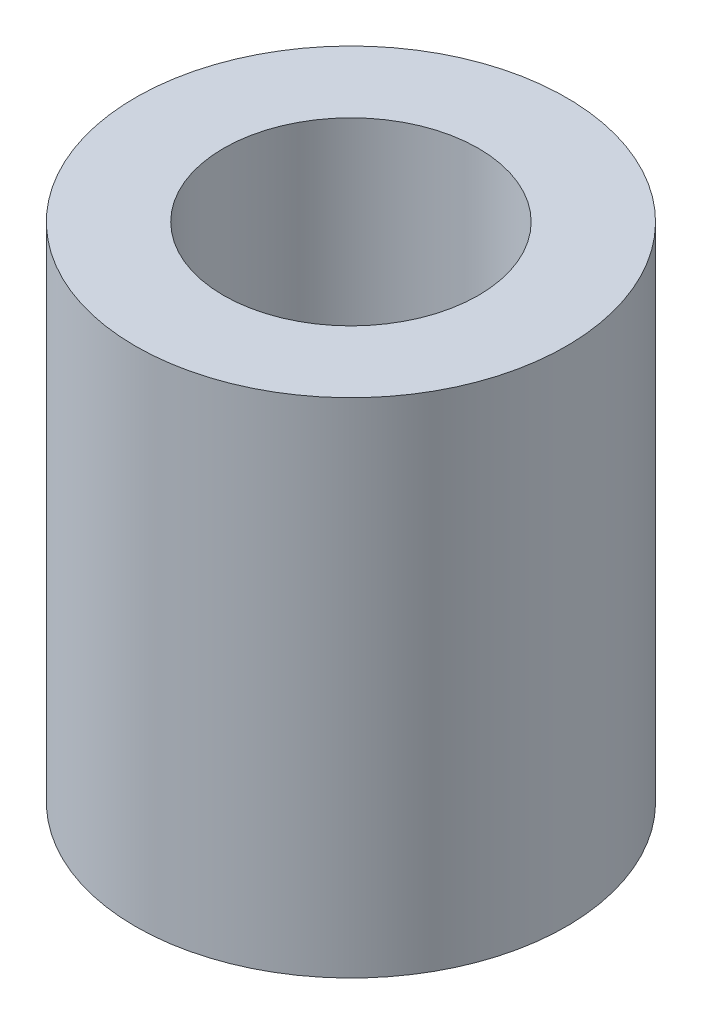
ISO-10303-21;
HEADER;
FILE_DESCRIPTION(('STEP AP214'),'2;1');
FILE_NAME('part.step','',(''),(''),'','','');
FILE_SCHEMA(('AUTOMOTIVE_DESIGN { 1 0 10303 214 1 1 1 1 }'));
ENDSEC;
DATA;
#1=APPLICATION_CONTEXT('core data for automotive mechanical design processes');
#2=APPLICATION_PROTOCOL_DEFINITION('international standard','automotive_design',2000,#1);
#3=PRODUCT_CONTEXT('',#1,'mechanical');
#4=PRODUCT('Part','Part','',(#3));
#5=PRODUCT_RELATED_PRODUCT_CATEGORY('part','',(#4));
#6=PRODUCT_DEFINITION_FORMATION('','',#4);
#7=PRODUCT_DEFINITION_CONTEXT('part definition',#1,'design');
#8=PRODUCT_DEFINITION('design','',#6,#7);
#9=PRODUCT_DEFINITION_SHAPE('','',#8);
#10=(LENGTH_UNIT() NAMED_UNIT(*) SI_UNIT(.MILLI.,.METRE.));
#11=(NAMED_UNIT(*) PLANE_ANGLE_UNIT() SI_UNIT($,.RADIAN.));
#12=(NAMED_UNIT(*) SI_UNIT($,.STERADIAN.) SOLID_ANGLE_UNIT());
#13=UNCERTAINTY_MEASURE_WITH_UNIT(LENGTH_MEASURE(1.E-05),#10,'distance_accuracy_value','');
#14=(GEOMETRIC_REPRESENTATION_CONTEXT(3) GLOBAL_UNCERTAINTY_ASSIGNED_CONTEXT((#13)) GLOBAL_UNIT_ASSIGNED_CONTEXT((#10,
#11,#12)) REPRESENTATION_CONTEXT('',''));
#15=CARTESIAN_POINT('',(0.,0.,0.));
#16=DIRECTION('',(0.,0.,1.));
#17=DIRECTION('',(1.,0.,0.));
#18=AXIS2_PLACEMENT_3D('',#15,#16,#17);
#19=CARTESIAN_POINT('',(0.,7.,0.));
#20=DIRECTION('',(0.,-1.,0.));
#21=DIRECTION('',(0.,0.,-1.));
#22=AXIS2_PLACEMENT_3D('',#19,#20,#21);
#23=CYLINDRICAL_SURFACE('',#22,3.);
#24=CARTESIAN_POINT('',(0.,7.,0.));
#25=DIRECTION('',(0.,1.,0.));
#26=DIRECTION('',(0.,0.,1.));
#27=AXIS2_PLACEMENT_3D('',#24,#25,#26);
#28=CIRCLE('',#27,3.);
#29=CARTESIAN_POINT('',(0.,7.,3.));
#30=VERTEX_POINT('',#29);
#31=EDGE_CURVE('E10',#30,#30,#28,.T.);
#32=ORIENTED_EDGE('',*,*,#31,.F.);
#33=EDGE_LOOP('',(#32));
#34=FACE_BOUND('',#33,.T.);
#35=CARTESIAN_POINT('',(0.,0.,0.));
#36=DIRECTION('',(0.,1.,0.));
#37=DIRECTION('',(0.,0.,1.));
#38=AXIS2_PLACEMENT_3D('',#35,#36,#37);
#39=CIRCLE('',#38,3.);
#40=CARTESIAN_POINT('',(0.,0.,3.));
#41=VERTEX_POINT('',#40);
#42=EDGE_CURVE('E34',#41,#41,#39,.T.);
#43=ORIENTED_EDGE('',*,*,#42,.T.);
#44=EDGE_LOOP('',(#43));
#45=FACE_BOUND('',#44,.T.);
#46=ADVANCED_FACE('F31',(#34,#45),#23,.T.);
#47=CARTESIAN_POINT('',(0.,7.,0.));
#48=DIRECTION('',(0.,1.,0.));
#49=DIRECTION('',(0.,0.,1.));
#50=AXIS2_PLACEMENT_3D('',#47,#48,#49);
#51=PLANE('',#50);
#52=CARTESIAN_POINT('',(0.,7.,0.));
#53=DIRECTION('',(0.,1.,0.));
#54=DIRECTION('',(0.,0.,1.));
#55=AXIS2_PLACEMENT_3D('',#52,#53,#54);
#56=CIRCLE('',#55,1.775);
#57=CARTESIAN_POINT('',(0.,7.,1.775));
#58=VERTEX_POINT('',#57);
#59=EDGE_CURVE('E43',#58,#58,#56,.T.);
#60=ORIENTED_EDGE('',*,*,#59,.F.);
#61=EDGE_LOOP('',(#60));
#62=FACE_BOUND('',#61,.T.);
#63=ORIENTED_EDGE('',*,*,#31,.T.);
#64=EDGE_LOOP('',(#63));
#65=FACE_BOUND('',#64,.T.);
#66=ADVANCED_FACE('F58',(#62,#65),#51,.T.);
#67=CARTESIAN_POINT('',(0.,0.,0.));
#68=DIRECTION('',(0.,1.,0.));
#69=DIRECTION('',(0.,0.,1.));
#70=AXIS2_PLACEMENT_3D('',#67,#68,#69);
#71=PLANE('',#70);
#72=CARTESIAN_POINT('',(0.,0.,0.));
#73=DIRECTION('',(0.,1.,0.));
#74=DIRECTION('',(0.,0.,1.));
#75=AXIS2_PLACEMENT_3D('',#72,#73,#74);
#76=CIRCLE('',#75,1.775);
#77=CARTESIAN_POINT('',(0.,0.,1.775));
#78=VERTEX_POINT('',#77);
#79=EDGE_CURVE('E41',#78,#78,#76,.T.);
#80=ORIENTED_EDGE('',*,*,#79,.T.);
#81=EDGE_LOOP('',(#80));
#82=FACE_BOUND('',#81,.T.);
#83=ORIENTED_EDGE('',*,*,#42,.F.);
#84=EDGE_LOOP('',(#83));
#85=FACE_BOUND('',#84,.T.);
#86=ADVANCED_FACE('F49',(#82,#85),#71,.F.);
#87=CARTESIAN_POINT('',(0.,0.,0.));
#88=DIRECTION('',(0.,1.,0.));
#89=DIRECTION('',(0.,0.,1.));
#90=AXIS2_PLACEMENT_3D('',#87,#88,#89);
#91=CYLINDRICAL_SURFACE('',#90,1.775);
#92=ORIENTED_EDGE('',*,*,#79,.F.);
#93=EDGE_LOOP('',(#92));
#94=FACE_BOUND('',#93,.T.);
#95=ORIENTED_EDGE('',*,*,#59,.T.);
#96=EDGE_LOOP('',(#95));
#97=FACE_BOUND('',#96,.T.);
#98=ADVANCED_FACE('F52',(#94,#97),#91,.F.);
#99=CLOSED_SHELL('',(#46,#66,#86,#98));
#100=MANIFOLD_SOLID_BREP('B2',#99);
#101=ADVANCED_BREP_SHAPE_REPRESENTATION('',(#18,#100),#14);
#102=SHAPE_DEFINITION_REPRESENTATION(#9,#101);
ENDSEC;
END-ISO-10303-21;
